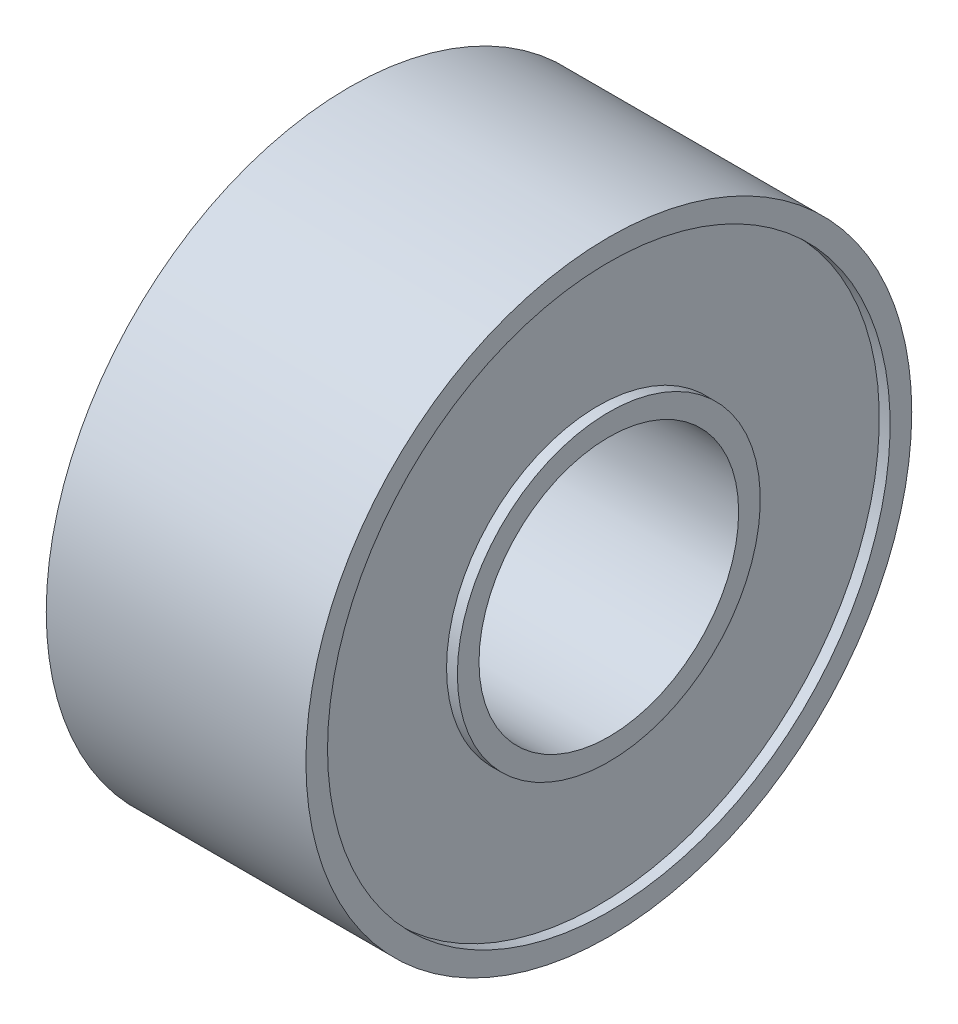
ISO-10303-21;
HEADER;
FILE_DESCRIPTION(('STEP AP214'),'2;1');
FILE_NAME('part.step','',(''),(''),'','','');
FILE_SCHEMA(('AUTOMOTIVE_DESIGN { 1 0 10303 214 1 1 1 1 }'));
ENDSEC;
DATA;
#1=APPLICATION_CONTEXT('core data for automotive mechanical design processes');
#2=APPLICATION_PROTOCOL_DEFINITION('international standard','automotive_design',2000,#1);
#3=PRODUCT_CONTEXT('',#1,'mechanical');
#4=PRODUCT('Part','Part','',(#3));
#5=PRODUCT_RELATED_PRODUCT_CATEGORY('part','',(#4));
#6=PRODUCT_DEFINITION_FORMATION('','',#4);
#7=PRODUCT_DEFINITION_CONTEXT('part definition',#1,'design');
#8=PRODUCT_DEFINITION('design','',#6,#7);
#9=PRODUCT_DEFINITION_SHAPE('','',#8);
#10=(LENGTH_UNIT() NAMED_UNIT(*) SI_UNIT(.MILLI.,.METRE.));
#11=(NAMED_UNIT(*) PLANE_ANGLE_UNIT() SI_UNIT($,.RADIAN.));
#12=(NAMED_UNIT(*) SI_UNIT($,.STERADIAN.) SOLID_ANGLE_UNIT());
#13=UNCERTAINTY_MEASURE_WITH_UNIT(LENGTH_MEASURE(1.E-05),#10,'distance_accuracy_value','');
#14=(GEOMETRIC_REPRESENTATION_CONTEXT(3) GLOBAL_UNCERTAINTY_ASSIGNED_CONTEXT((#13)) GLOBAL_UNIT_ASSIGNED_CONTEXT((#10,
#11,#12)) REPRESENTATION_CONTEXT('',''));
#15=CARTESIAN_POINT('',(0.,0.,0.));
#16=DIRECTION('',(0.,0.,1.));
#17=DIRECTION('',(1.,0.,0.));
#18=AXIS2_PLACEMENT_3D('',#15,#16,#17);
#19=CARTESIAN_POINT('',(0.,13.,0.));
#20=DIRECTION('',(1.,0.,0.));
#21=DIRECTION('',(0.,0.,-1.));
#22=AXIS2_PLACEMENT_3D('',#19,#20,#21);
#23=PLANE('',#22);
#24=CARTESIAN_POINT('',(0.,0.,0.));
#25=DIRECTION('',(-1.,0.,0.));
#26=DIRECTION('',(0.,0.,1.));
#27=AXIS2_PLACEMENT_3D('',#24,#25,#26);
#28=CIRCLE('',#27,13.);
#29=CARTESIAN_POINT('',(0.,0.,13.));
#30=VERTEX_POINT('',#29);
#31=EDGE_CURVE('E94',#30,#30,#28,.T.);
#32=ORIENTED_EDGE('',*,*,#31,.F.);
#33=EDGE_LOOP('',(#32));
#34=FACE_BOUND('',#33,.T.);
#35=CARTESIAN_POINT('',(0.,0.,0.));
#36=DIRECTION('',(-1.,0.,0.));
#37=DIRECTION('',(0.,0.,1.));
#38=AXIS2_PLACEMENT_3D('',#35,#36,#37);
#39=CIRCLE('',#38,14.);
#40=CARTESIAN_POINT('',(0.,0.,14.));
#41=VERTEX_POINT('',#40);
#42=EDGE_CURVE('E10',#41,#41,#39,.T.);
#43=ORIENTED_EDGE('',*,*,#42,.T.);
#44=EDGE_LOOP('',(#43));
#45=FACE_BOUND('',#44,.T.);
#46=ADVANCED_FACE('F43',(#34,#45),#23,.F.);
#47=CARTESIAN_POINT('',(0.,0.,0.));
#48=DIRECTION('',(-1.,0.,0.));
#49=DIRECTION('',(0.,0.,1.));
#50=AXIS2_PLACEMENT_3D('',#47,#48,#49);
#51=CYLINDRICAL_SURFACE('',#50,14.);
#52=ORIENTED_EDGE('',*,*,#42,.F.);
#53=EDGE_LOOP('',(#52));
#54=FACE_BOUND('',#53,.T.);
#55=CARTESIAN_POINT('',(12.,0.,0.));
#56=DIRECTION('',(-1.,0.,0.));
#57=DIRECTION('',(0.,0.,1.));
#58=AXIS2_PLACEMENT_3D('',#55,#56,#57);
#59=CIRCLE('',#58,14.);
#60=CARTESIAN_POINT('',(12.,0.,14.));
#61=VERTEX_POINT('',#60);
#62=EDGE_CURVE('E50',#61,#61,#59,.T.);
#63=ORIENTED_EDGE('',*,*,#62,.T.);
#64=EDGE_LOOP('',(#63));
#65=FACE_BOUND('',#64,.T.);
#66=ADVANCED_FACE('F102',(#54,#65),#51,.T.);
#67=CARTESIAN_POINT('',(12.,14.,0.));
#68=DIRECTION('',(-1.,0.,0.));
#69=DIRECTION('',(0.,0.,1.));
#70=AXIS2_PLACEMENT_3D('',#67,#68,#69);
#71=PLANE('',#70);
#72=ORIENTED_EDGE('',*,*,#62,.F.);
#73=EDGE_LOOP('',(#72));
#74=FACE_BOUND('',#73,.T.);
#75=CARTESIAN_POINT('',(12.,0.,0.));
#76=DIRECTION('',(-1.,0.,0.));
#77=DIRECTION('',(0.,0.,1.));
#78=AXIS2_PLACEMENT_3D('',#75,#76,#77);
#79=CIRCLE('',#78,13.);
#80=CARTESIAN_POINT('',(12.,0.,13.));
#81=VERTEX_POINT('',#80);
#82=EDGE_CURVE('E55',#81,#81,#79,.T.);
#83=ORIENTED_EDGE('',*,*,#82,.T.);
#84=EDGE_LOOP('',(#83));
#85=FACE_BOUND('',#84,.T.);
#86=ADVANCED_FACE('F106',(#74,#85),#71,.F.);
#87=CARTESIAN_POINT('',(0.,0.,0.));
#88=DIRECTION('',(-1.,0.,0.));
#89=DIRECTION('',(0.,0.,1.));
#90=AXIS2_PLACEMENT_3D('',#87,#88,#89);
#91=CYLINDRICAL_SURFACE('',#90,13.);
#92=ORIENTED_EDGE('',*,*,#82,.F.);
#93=EDGE_LOOP('',(#92));
#94=FACE_BOUND('',#93,.T.);
#95=CARTESIAN_POINT('',(11.5,0.,0.));
#96=DIRECTION('',(-1.,0.,0.));
#97=DIRECTION('',(0.,0.,1.));
#98=AXIS2_PLACEMENT_3D('',#95,#96,#97);
#99=CIRCLE('',#98,13.);
#100=CARTESIAN_POINT('',(11.5,0.,13.));
#101=VERTEX_POINT('',#100);
#102=EDGE_CURVE('E60',#101,#101,#99,.T.);
#103=ORIENTED_EDGE('',*,*,#102,.T.);
#104=EDGE_LOOP('',(#103));
#105=FACE_BOUND('',#104,.T.);
#106=ADVANCED_FACE('F111',(#94,#105),#91,.F.);
#107=CARTESIAN_POINT('',(11.5,13.,0.));
#108=DIRECTION('',(-1.,0.,0.));
#109=DIRECTION('',(0.,0.,1.));
#110=AXIS2_PLACEMENT_3D('',#107,#108,#109);
#111=PLANE('',#110);
#112=ORIENTED_EDGE('',*,*,#102,.F.);
#113=EDGE_LOOP('',(#112));
#114=FACE_BOUND('',#113,.T.);
#115=CARTESIAN_POINT('',(11.5,0.,0.));
#116=DIRECTION('',(-1.,0.,0.));
#117=DIRECTION('',(0.,0.,1.));
#118=AXIS2_PLACEMENT_3D('',#115,#116,#117);
#119=CIRCLE('',#118,7.);
#120=CARTESIAN_POINT('',(11.5,0.,7.));
#121=VERTEX_POINT('',#120);
#122=EDGE_CURVE('E66',#121,#121,#119,.T.);
#123=ORIENTED_EDGE('',*,*,#122,.T.);
#124=EDGE_LOOP('',(#123));
#125=FACE_BOUND('',#124,.T.);
#126=ADVANCED_FACE('F117',(#114,#125),#111,.F.);
#127=CARTESIAN_POINT('',(0.,0.,0.));
#128=DIRECTION('',(-1.,0.,0.));
#129=DIRECTION('',(0.,0.,1.));
#130=AXIS2_PLACEMENT_3D('',#127,#128,#129);
#131=CYLINDRICAL_SURFACE('',#130,7.);
#132=ORIENTED_EDGE('',*,*,#122,.F.);
#133=EDGE_LOOP('',(#132));
#134=FACE_BOUND('',#133,.T.);
#135=CARTESIAN_POINT('',(12.,0.,0.));
#136=DIRECTION('',(-1.,0.,0.));
#137=DIRECTION('',(0.,0.,1.));
#138=AXIS2_PLACEMENT_3D('',#135,#136,#137);
#139=CIRCLE('',#138,7.);
#140=CARTESIAN_POINT('',(12.,0.,7.));
#141=VERTEX_POINT('',#140);
#142=EDGE_CURVE('E70',#141,#141,#139,.T.);
#143=ORIENTED_EDGE('',*,*,#142,.T.);
#144=EDGE_LOOP('',(#143));
#145=FACE_BOUND('',#144,.T.);
#146=ADVANCED_FACE('F121',(#134,#145),#131,.T.);
#147=CARTESIAN_POINT('',(12.,7.,0.));
#148=DIRECTION('',(-1.,0.,0.));
#149=DIRECTION('',(0.,0.,1.));
#150=AXIS2_PLACEMENT_3D('',#147,#148,#149);
#151=PLANE('',#150);
#152=ORIENTED_EDGE('',*,*,#142,.F.);
#153=EDGE_LOOP('',(#152));
#154=FACE_BOUND('',#153,.T.);
#155=CARTESIAN_POINT('',(12.,0.,0.));
#156=DIRECTION('',(-1.,0.,0.));
#157=DIRECTION('',(0.,0.,1.));
#158=AXIS2_PLACEMENT_3D('',#155,#156,#157);
#159=CIRCLE('',#158,6.);
#160=CARTESIAN_POINT('',(12.,0.,6.));
#161=VERTEX_POINT('',#160);
#162=EDGE_CURVE('E74',#161,#161,#159,.T.);
#163=ORIENTED_EDGE('',*,*,#162,.T.);
#164=EDGE_LOOP('',(#163));
#165=FACE_BOUND('',#164,.T.);
#166=ADVANCED_FACE('F125',(#154,#165),#151,.F.);
#167=CARTESIAN_POINT('',(0.,0.,0.));
#168=DIRECTION('',(-1.,0.,0.));
#169=DIRECTION('',(0.,0.,1.));
#170=AXIS2_PLACEMENT_3D('',#167,#168,#169);
#171=CYLINDRICAL_SURFACE('',#170,6.);
#172=ORIENTED_EDGE('',*,*,#162,.F.);
#173=EDGE_LOOP('',(#172));
#174=FACE_BOUND('',#173,.T.);
#175=CARTESIAN_POINT('',(0.,0.,0.));
#176=DIRECTION('',(-1.,0.,0.));
#177=DIRECTION('',(0.,0.,1.));
#178=AXIS2_PLACEMENT_3D('',#175,#176,#177);
#179=CIRCLE('',#178,6.);
#180=CARTESIAN_POINT('',(0.,0.,6.));
#181=VERTEX_POINT('',#180);
#182=EDGE_CURVE('E78',#181,#181,#179,.T.);
#183=ORIENTED_EDGE('',*,*,#182,.T.);
#184=EDGE_LOOP('',(#183));
#185=FACE_BOUND('',#184,.T.);
#186=ADVANCED_FACE('F129',(#174,#185),#171,.F.);
#187=CARTESIAN_POINT('',(0.,6.,0.));
#188=DIRECTION('',(1.,0.,0.));
#189=DIRECTION('',(0.,0.,-1.));
#190=AXIS2_PLACEMENT_3D('',#187,#188,#189);
#191=PLANE('',#190);
#192=ORIENTED_EDGE('',*,*,#182,.F.);
#193=EDGE_LOOP('',(#192));
#194=FACE_BOUND('',#193,.T.);
#195=CARTESIAN_POINT('',(0.,0.,0.));
#196=DIRECTION('',(-1.,0.,0.));
#197=DIRECTION('',(0.,0.,1.));
#198=AXIS2_PLACEMENT_3D('',#195,#196,#197);
#199=CIRCLE('',#198,7.);
#200=CARTESIAN_POINT('',(0.,0.,7.));
#201=VERTEX_POINT('',#200);
#202=EDGE_CURVE('E82',#201,#201,#199,.T.);
#203=ORIENTED_EDGE('',*,*,#202,.T.);
#204=EDGE_LOOP('',(#203));
#205=FACE_BOUND('',#204,.T.);
#206=ADVANCED_FACE('F133',(#194,#205),#191,.F.);
#207=CARTESIAN_POINT('',(0.,0.,0.));
#208=DIRECTION('',(-1.,0.,0.));
#209=DIRECTION('',(0.,0.,1.));
#210=AXIS2_PLACEMENT_3D('',#207,#208,#209);
#211=CYLINDRICAL_SURFACE('',#210,7.);
#212=ORIENTED_EDGE('',*,*,#202,.F.);
#213=EDGE_LOOP('',(#212));
#214=FACE_BOUND('',#213,.T.);
#215=CARTESIAN_POINT('',(0.5,0.,0.));
#216=DIRECTION('',(-1.,0.,0.));
#217=DIRECTION('',(0.,0.,1.));
#218=AXIS2_PLACEMENT_3D('',#215,#216,#217);
#219=CIRCLE('',#218,7.);
#220=CARTESIAN_POINT('',(0.5,0.,7.));
#221=VERTEX_POINT('',#220);
#222=EDGE_CURVE('E86',#221,#221,#219,.T.);
#223=ORIENTED_EDGE('',*,*,#222,.T.);
#224=EDGE_LOOP('',(#223));
#225=FACE_BOUND('',#224,.T.);
#226=ADVANCED_FACE('F137',(#214,#225),#211,.T.);
#227=CARTESIAN_POINT('',(0.5,7.,0.));
#228=DIRECTION('',(1.,0.,0.));
#229=DIRECTION('',(0.,0.,-1.));
#230=AXIS2_PLACEMENT_3D('',#227,#228,#229);
#231=PLANE('',#230);
#232=ORIENTED_EDGE('',*,*,#222,.F.);
#233=EDGE_LOOP('',(#232));
#234=FACE_BOUND('',#233,.T.);
#235=CARTESIAN_POINT('',(0.5,0.,0.));
#236=DIRECTION('',(-1.,0.,0.));
#237=DIRECTION('',(0.,0.,1.));
#238=AXIS2_PLACEMENT_3D('',#235,#236,#237);
#239=CIRCLE('',#238,13.);
#240=CARTESIAN_POINT('',(0.5,0.,13.));
#241=VERTEX_POINT('',#240);
#242=EDGE_CURVE('E90',#241,#241,#239,.T.);
#243=ORIENTED_EDGE('',*,*,#242,.T.);
#244=EDGE_LOOP('',(#243));
#245=FACE_BOUND('',#244,.T.);
#246=ADVANCED_FACE('F141',(#234,#245),#231,.F.);
#247=CARTESIAN_POINT('',(0.,0.,0.));
#248=DIRECTION('',(-1.,0.,0.));
#249=DIRECTION('',(0.,0.,1.));
#250=AXIS2_PLACEMENT_3D('',#247,#248,#249);
#251=CYLINDRICAL_SURFACE('',#250,13.);
#252=ORIENTED_EDGE('',*,*,#242,.F.);
#253=EDGE_LOOP('',(#252));
#254=FACE_BOUND('',#253,.T.);
#255=ORIENTED_EDGE('',*,*,#31,.T.);
#256=EDGE_LOOP('',(#255));
#257=FACE_BOUND('',#256,.T.);
#258=ADVANCED_FACE('F99',(#254,#257),#251,.F.);
#259=CLOSED_SHELL('',(#46,#66,#86,#106,#126,#146,#166,#186,#206,#226,#246,#258));
#260=MANIFOLD_SOLID_BREP('B2',#259);
#261=ADVANCED_BREP_SHAPE_REPRESENTATION('',(#18,#260),#14);
#262=SHAPE_DEFINITION_REPRESENTATION(#9,#261);
ENDSEC;
END-ISO-10303-21;
